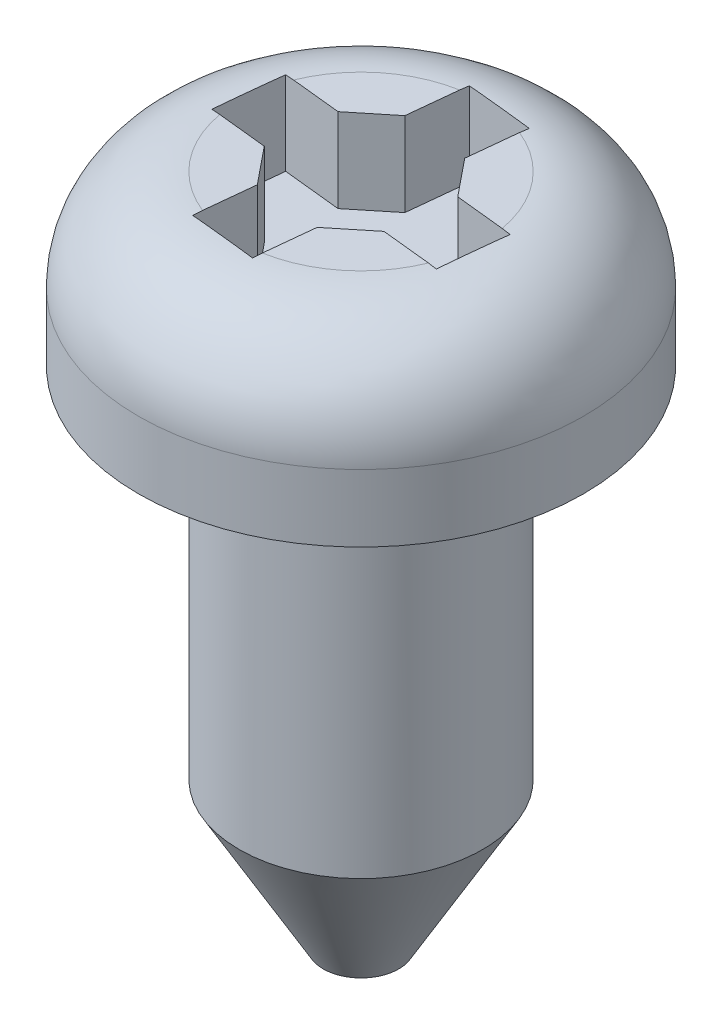
ISO-10303-21;
HEADER;
FILE_DESCRIPTION(('STEP AP214'),'2;1');
FILE_NAME('part.step','',(''),(''),'','','');
FILE_SCHEMA(('AUTOMOTIVE_DESIGN { 1 0 10303 214 1 1 1 1 }'));
ENDSEC;
DATA;
#1=APPLICATION_CONTEXT('core data for automotive mechanical design processes');
#2=APPLICATION_PROTOCOL_DEFINITION('international standard','automotive_design',2000,#1);
#3=PRODUCT_CONTEXT('',#1,'mechanical');
#4=PRODUCT('Part','Part','',(#3));
#5=PRODUCT_RELATED_PRODUCT_CATEGORY('part','',(#4));
#6=PRODUCT_DEFINITION_FORMATION('','',#4);
#7=PRODUCT_DEFINITION_CONTEXT('part definition',#1,'design');
#8=PRODUCT_DEFINITION('design','',#6,#7);
#9=PRODUCT_DEFINITION_SHAPE('','',#8);
#10=(LENGTH_UNIT() NAMED_UNIT(*) SI_UNIT(.MILLI.,.METRE.));
#11=(NAMED_UNIT(*) PLANE_ANGLE_UNIT() SI_UNIT($,.RADIAN.));
#12=(NAMED_UNIT(*) SI_UNIT($,.STERADIAN.) SOLID_ANGLE_UNIT());
#13=UNCERTAINTY_MEASURE_WITH_UNIT(LENGTH_MEASURE(1.E-05),#10,'distance_accuracy_value','');
#14=(GEOMETRIC_REPRESENTATION_CONTEXT(3) GLOBAL_UNCERTAINTY_ASSIGNED_CONTEXT((#13)) GLOBAL_UNIT_ASSIGNED_CONTEXT((#10,
#11,#12)) REPRESENTATION_CONTEXT('',''));
#15=CARTESIAN_POINT('',(0.,0.,0.));
#16=DIRECTION('',(0.,0.,1.));
#17=DIRECTION('',(1.,0.,0.));
#18=AXIS2_PLACEMENT_3D('',#15,#16,#17);
#19=CARTESIAN_POINT('',(-137.886519874981,9.29457308248913,4.83712317671311));
#20=DIRECTION('',(0.630075332995943,0.,0.776534013904125));
#21=DIRECTION('',(0.776534013904125,0.,-0.630075332995943));
#22=AXIS2_PLACEMENT_3D('',#19,#20,#21);
#23=PLANE('',#22);
#24=DIRECTION('',(0.,1.,0.));
#25=VECTOR('',#24,1.);
#26=CARTESIAN_POINT('',(-137.447245901338,9.29457308248913,4.48069874421721));
#27=LINE('',#26,#25);
#28=CARTESIAN_POINT('',(-137.447245901338,10.2945730824891,4.48069874421714));
#29=VERTEX_POINT('',#28);
#30=CARTESIAN_POINT('',(-137.447245901338,9.29457308248913,4.48069874421721));
#31=VERTEX_POINT('',#30);
#32=EDGE_CURVE('E557',#29,#31,#27,.F.);
#33=ORIENTED_EDGE('',*,*,#32,.T.);
#34=DIRECTION('',(-0.776534013904144,0.,0.63007533299592));
#35=VECTOR('',#34,1.);
#36=CARTESIAN_POINT('',(-137.447245901338,9.29457308248913,4.48069874421721));
#37=LINE('',#36,#35);
#38=CARTESIAN_POINT('',(-137.886519874981,9.29457308248913,4.83712317671309));
#39=VERTEX_POINT('',#38);
#40=EDGE_CURVE('E555',#31,#39,#37,.T.);
#41=ORIENTED_EDGE('',*,*,#40,.T.);
#42=DIRECTION('',(0.,1.,0.));
#43=VECTOR('',#42,1.);
#44=CARTESIAN_POINT('',(-137.886519874981,9.29457308248913,4.83712317671308));
#45=LINE('',#44,#43);
#46=CARTESIAN_POINT('',(-137.886519874981,10.2945730824891,4.83712317671314));
#47=VERTEX_POINT('',#46);
#48=EDGE_CURVE('E540',#39,#47,#45,.T.);
#49=ORIENTED_EDGE('',*,*,#48,.T.);
#50=DIRECTION('',(-0.776534013904049,0.,0.630075332996037));
#51=VECTOR('',#50,1.);
#52=CARTESIAN_POINT('',(-137.447245901338,10.2945730824891,4.4806987442171));
#53=LINE('',#52,#51);
#54=EDGE_CURVE('E547',#29,#47,#53,.T.);
#55=ORIENTED_EDGE('',*,*,#54,.F.);
#56=EDGE_LOOP('',(#33,#41,#49,#55));
#57=FACE_BOUND('',#56,.T.);
#58=ADVANCED_FACE('F17',(#57),#23,.F.);
#59=CARTESIAN_POINT('',(-138.68221828112,9.29457308248913,4.75427363556607));
#60=DIRECTION('',(-0.776534013904126,0.,0.630075332995942));
#61=DIRECTION('',(0.630075332995942,0.,0.776534013904126));
#62=AXIS2_PLACEMENT_3D('',#59,#60,#61);
#63=PLANE('',#62);
#64=DIRECTION('',(0.,1.,0.));
#65=VECTOR('',#64,1.);
#66=CARTESIAN_POINT('',(-138.682218281119,9.29457308248913,4.75427363556587));
#67=LINE('',#66,#65);
#68=CARTESIAN_POINT('',(-138.68221828112,10.2945730824891,4.75427363556582));
#69=VERTEX_POINT('',#68);
#70=CARTESIAN_POINT('',(-138.68221828112,9.29457308248913,4.75427363556594));
#71=VERTEX_POINT('',#70);
#72=EDGE_CURVE('E140',#69,#71,#67,.F.);
#73=ORIENTED_EDGE('',*,*,#72,.T.);
#74=DIRECTION('',(-0.630075332996113,0.,-0.776534013903987));
#75=VECTOR('',#74,1.);
#76=CARTESIAN_POINT('',(-138.68221828112,9.29457308248913,4.75427363556607));
#77=LINE('',#76,#75);
#78=CARTESIAN_POINT('',(-139.038642713616,9.29457308248913,4.31499966192314));
#79=VERTEX_POINT('',#78);
#80=EDGE_CURVE('E133',#71,#79,#77,.T.);
#81=ORIENTED_EDGE('',*,*,#80,.T.);
#82=DIRECTION('',(0.,1.,0.));
#83=VECTOR('',#82,1.);
#84=CARTESIAN_POINT('',(-139.038642713616,9.29457308248913,4.31499966192314));
#85=LINE('',#84,#83);
#86=CARTESIAN_POINT('',(-139.038642713616,10.2945730824891,4.31499966192312));
#87=VERTEX_POINT('',#86);
#88=EDGE_CURVE('E476',#79,#87,#85,.T.);
#89=ORIENTED_EDGE('',*,*,#88,.T.);
#90=DIRECTION('',(-0.630075332996226,0.,-0.776534013903895));
#91=VECTOR('',#90,1.);
#92=CARTESIAN_POINT('',(-138.68221828112,10.2945730824891,4.7542736355658));
#93=LINE('',#92,#91);
#94=EDGE_CURVE('E642',#69,#87,#93,.T.);
#95=ORIENTED_EDGE('',*,*,#94,.F.);
#96=EDGE_LOOP('',(#73,#81,#89,#95));
#97=FACE_BOUND('',#96,.T.);
#98=ADVANCED_FACE('F239',(#97),#63,.F.);
#99=CARTESIAN_POINT('',(-138.516519198826,9.29457308248913,3.16287682328872));
#100=DIRECTION('',(-0.630075332995943,0.,-0.776534013904125));
#101=DIRECTION('',(-0.776534013904125,0.,0.630075332995943));
#102=AXIS2_PLACEMENT_3D('',#99,#100,#101);
#103=PLANE('',#102);
#104=DIRECTION('',(0.,1.,0.));
#105=VECTOR('',#104,1.);
#106=CARTESIAN_POINT('',(-138.955793172469,9.29457308248913,3.51930125578437));
#107=LINE('',#106,#105);
#108=CARTESIAN_POINT('',(-138.955793172469,10.2945730824891,3.51930125578437));
#109=VERTEX_POINT('',#108);
#110=CARTESIAN_POINT('',(-138.955793172469,9.29457308248913,3.51930125578437));
#111=VERTEX_POINT('',#110);
#112=EDGE_CURVE('E628',#109,#111,#107,.F.);
#113=ORIENTED_EDGE('',*,*,#112,.T.);
#114=DIRECTION('',(0.77653401390436,0.,-0.630075332995654));
#115=VECTOR('',#114,1.);
#116=CARTESIAN_POINT('',(-138.955793172469,9.29457308248913,3.51930125578437));
#117=LINE('',#116,#115);
#118=CARTESIAN_POINT('',(-138.516519198826,9.29457308248913,3.16287682328874));
#119=VERTEX_POINT('',#118);
#120=EDGE_CURVE('E598',#111,#119,#117,.T.);
#121=ORIENTED_EDGE('',*,*,#120,.T.);
#122=DIRECTION('',(0.,1.,0.));
#123=VECTOR('',#122,1.);
#124=CARTESIAN_POINT('',(-138.516519198826,9.29457308248913,3.16287682328875));
#125=LINE('',#124,#123);
#126=CARTESIAN_POINT('',(-138.516519198826,10.2945730824891,3.16287682328863));
#127=VERTEX_POINT('',#126);
#128=EDGE_CURVE('E392',#119,#127,#125,.T.);
#129=ORIENTED_EDGE('',*,*,#128,.T.);
#130=DIRECTION('',(0.776534013904075,0.,-0.630075332996005));
#131=VECTOR('',#130,1.);
#132=CARTESIAN_POINT('',(-138.955793172469,10.2945730824891,3.51930125578437));
#133=LINE('',#132,#131);
#134=EDGE_CURVE('E412',#109,#127,#133,.T.);
#135=ORIENTED_EDGE('',*,*,#134,.F.);
#136=EDGE_LOOP('',(#113,#121,#129,#135));
#137=FACE_BOUND('',#136,.T.);
#138=ADVANCED_FACE('F236',(#137),#103,.F.);
#139=CARTESIAN_POINT('',(-137.720820792687,9.29457308248913,3.24572636443531));
#140=DIRECTION('',(0.776534013904126,0.,-0.630075332995942));
#141=DIRECTION('',(-0.630075332995942,0.,-0.776534013904126));
#142=AXIS2_PLACEMENT_3D('',#139,#140,#141);
#143=PLANE('',#142);
#144=DIRECTION('',(0.,1.,0.));
#145=VECTOR('',#144,1.);
#146=CARTESIAN_POINT('',(-137.720820792687,9.29457308248913,3.24572636443534));
#147=LINE('',#146,#145);
#148=CARTESIAN_POINT('',(-137.720820792687,10.2945730824891,3.24572636443532));
#149=VERTEX_POINT('',#148);
#150=CARTESIAN_POINT('',(-137.720820792687,9.29457308248913,3.24572636443533));
#151=VERTEX_POINT('',#150);
#152=EDGE_CURVE('E601',#149,#151,#147,.F.);
#153=ORIENTED_EDGE('',*,*,#152,.T.);
#154=DIRECTION('',(0.630075332996023,0.,0.77653401390406));
#155=VECTOR('',#154,1.);
#156=CARTESIAN_POINT('',(-137.720820792687,9.29457308248913,3.24572636443531));
#157=LINE('',#156,#155);
#158=CARTESIAN_POINT('',(-137.364396360191,9.29457308248913,3.68500033807831));
#159=VERTEX_POINT('',#158);
#160=EDGE_CURVE('E558',#151,#159,#157,.T.);
#161=ORIENTED_EDGE('',*,*,#160,.T.);
#162=DIRECTION('',(0.,1.,0.));
#163=VECTOR('',#162,1.);
#164=CARTESIAN_POINT('',(-137.364396360191,9.29457308248913,3.68500033807831));
#165=LINE('',#164,#163);
#166=CARTESIAN_POINT('',(-137.364396360191,10.2945730824891,3.68500033807831));
#167=VERTEX_POINT('',#166);
#168=EDGE_CURVE('E593',#159,#167,#165,.T.);
#169=ORIENTED_EDGE('',*,*,#168,.T.);
#170=DIRECTION('',(0.630075332996023,0.,0.77653401390406));
#171=VECTOR('',#170,1.);
#172=CARTESIAN_POINT('',(-137.720820792687,10.2945730824891,3.24572636443531));
#173=LINE('',#172,#171);
#174=EDGE_CURVE('E329',#149,#167,#173,.T.);
#175=ORIENTED_EDGE('',*,*,#174,.F.);
#176=EDGE_LOOP('',(#153,#161,#169,#175));
#177=FACE_BOUND('',#176,.T.);
#178=ADVANCED_FACE('F233',(#177),#143,.F.);
#179=CARTESIAN_POINT('',(-137.845095104408,9.29457308248913,4.43927397364368));
#180=DIRECTION('',(0.,-1.,0.));
#181=DIRECTION('',(0.,0.,-1.));
#182=AXIS2_PLACEMENT_3D('',#179,#180,#181);
#183=PLANE('',#182);
#184=ORIENTED_EDGE('',*,*,#40,.F.);
#185=DIRECTION('',(0.994623007673419,0.,0.103561926433812));
#186=VECTOR('',#185,1.);
#187=CARTESIAN_POINT('',(-137.447245901338,9.29457308248913,4.48069874421721));
#188=LINE('',#187,#186);
#189=CARTESIAN_POINT('',(-136.751009795967,9.29457308248913,4.55319209272088));
#190=VERTEX_POINT('',#189);
#191=EDGE_CURVE('E562',#31,#190,#188,.T.);
#192=ORIENTED_EDGE('',*,*,#191,.T.);
#193=DIRECTION('',(0.10356192643381,0.,-0.994623007673419));
#194=VECTOR('',#193,1.);
#195=CARTESIAN_POINT('',(-136.751009795967,9.29457308248913,4.55319209272053));
#196=LINE('',#195,#194);
#197=CARTESIAN_POINT('',(-136.66816025482,9.29457308248913,3.75749368658209));
#198=VERTEX_POINT('',#197);
#199=EDGE_CURVE('E173',#190,#198,#196,.T.);
#200=ORIENTED_EDGE('',*,*,#199,.T.);
#201=DIRECTION('',(-0.994623007673419,0.,-0.103561926433812));
#202=VECTOR('',#201,1.);
#203=CARTESIAN_POINT('',(-137.364396360191,9.29457308248913,3.68500033807831));
#204=LINE('',#203,#202);
#205=EDGE_CURVE('E216',#198,#159,#204,.T.);
#206=ORIENTED_EDGE('',*,*,#205,.T.);
#207=ORIENTED_EDGE('',*,*,#160,.F.);
#208=DIRECTION('',(0.103561926433815,0.,-0.994623007673419));
#209=VECTOR('',#208,1.);
#210=CARTESIAN_POINT('',(-137.648327444183,9.29457308248913,2.54949025906405));
#211=LINE('',#210,#209);
#212=CARTESIAN_POINT('',(-137.648327444183,9.29457308248913,2.5494902590641));
#213=VERTEX_POINT('',#212);
#214=EDGE_CURVE('E603',#151,#213,#211,.T.);
#215=ORIENTED_EDGE('',*,*,#214,.T.);
#216=DIRECTION('',(-0.994623007673419,0.,-0.103561926433815));
#217=VECTOR('',#216,1.);
#218=CARTESIAN_POINT('',(-138.444025850322,9.29457308248913,2.46664071791713));
#219=LINE('',#218,#217);
#220=CARTESIAN_POINT('',(-138.444025850322,9.29457308248913,2.46664071791713));
#221=VERTEX_POINT('',#220);
#222=EDGE_CURVE('E391',#213,#221,#219,.T.);
#223=ORIENTED_EDGE('',*,*,#222,.T.);
#224=DIRECTION('',(-0.103561926433815,0.,0.994623007673419));
#225=VECTOR('',#224,1.);
#226=CARTESIAN_POINT('',(-138.444025850322,9.29457308248913,2.46664071791713));
#227=LINE('',#226,#225);
#228=EDGE_CURVE('E613',#221,#119,#227,.T.);
#229=ORIENTED_EDGE('',*,*,#228,.T.);
#230=ORIENTED_EDGE('',*,*,#120,.F.);
#231=DIRECTION('',(-0.994623007673419,0.,-0.103561926433812));
#232=VECTOR('',#231,1.);
#233=CARTESIAN_POINT('',(-138.955793172469,9.29457308248913,3.51930125578437));
#234=LINE('',#233,#232);
#235=CARTESIAN_POINT('',(-139.65202927784,9.29457308248913,3.44680790728074));
#236=VERTEX_POINT('',#235);
#237=EDGE_CURVE('E630',#111,#236,#234,.T.);
#238=ORIENTED_EDGE('',*,*,#237,.T.);
#239=DIRECTION('',(-0.10356192643381,0.,0.994623007673419));
#240=VECTOR('',#239,1.);
#241=CARTESIAN_POINT('',(-139.734878818987,9.29457308248913,4.24250631341928));
#242=LINE('',#241,#240);
#243=CARTESIAN_POINT('',(-139.734878818987,9.29457308248913,4.24250631341936));
#244=VERTEX_POINT('',#243);
#245=EDGE_CURVE('E475',#236,#244,#242,.T.);
#246=ORIENTED_EDGE('',*,*,#245,.T.);
#247=DIRECTION('',(0.994623007673419,0.,0.103561926433812));
#248=VECTOR('',#247,1.);
#249=CARTESIAN_POINT('',(-139.038642713616,9.29457308248913,4.31499966192314));
#250=LINE('',#249,#248);
#251=EDGE_CURVE('E640',#244,#79,#250,.T.);
#252=ORIENTED_EDGE('',*,*,#251,.T.);
#253=ORIENTED_EDGE('',*,*,#80,.F.);
#254=DIRECTION('',(-0.103561926433815,0.,0.994623007673419));
#255=VECTOR('',#254,1.);
#256=CARTESIAN_POINT('',(-138.754711629623,9.29457308248913,5.45050974093747));
#257=LINE('',#256,#255);
#258=CARTESIAN_POINT('',(-138.754711629623,9.29457308248913,5.45050974093747));
#259=VERTEX_POINT('',#258);
#260=EDGE_CURVE('E516',#71,#259,#257,.T.);
#261=ORIENTED_EDGE('',*,*,#260,.T.);
#262=DIRECTION('',(0.994623007673419,0.,0.103561926433815));
#263=VECTOR('',#262,1.);
#264=CARTESIAN_POINT('',(-138.754711629623,9.29457308248913,5.45050974093747));
#265=LINE('',#264,#263);
#266=CARTESIAN_POINT('',(-137.959013223485,9.29457308248913,5.53335928208445));
#267=VERTEX_POINT('',#266);
#268=EDGE_CURVE('E520',#259,#267,#265,.T.);
#269=ORIENTED_EDGE('',*,*,#268,.T.);
#270=DIRECTION('',(0.103561926433815,0.,-0.994623007673419));
#271=VECTOR('',#270,1.);
#272=CARTESIAN_POINT('',(-137.959013223485,9.29457308248913,5.53335928208458));
#273=LINE('',#272,#271);
#274=EDGE_CURVE('E543',#267,#39,#273,.T.);
#275=ORIENTED_EDGE('',*,*,#274,.T.);
#276=EDGE_LOOP('',(#184,#192,#200,#206,#207,#215,#223,#229,#230,#238,#246,#252,#253,#261,#269,#275));
#277=FACE_BOUND('',#276,.T.);
#278=ADVANCED_FACE('F228',(#277),#183,.F.);
#279=CARTESIAN_POINT('',(-137.447245901338,9.29457308248913,4.48069874421721));
#280=DIRECTION('',(-0.103561926433812,0.,0.994623007673419));
#281=DIRECTION('',(0.994623007673419,0.,0.103561926433812));
#282=AXIS2_PLACEMENT_3D('',#279,#280,#281);
#283=PLANE('',#282);
#284=DIRECTION('',(0.,1.,0.));
#285=VECTOR('',#284,1.);
#286=CARTESIAN_POINT('',(-136.751009795967,9.29457308248913,4.5531920927209));
#287=LINE('',#286,#285);
#288=CARTESIAN_POINT('',(-136.751009795967,10.290194536761,4.55319209272087));
#289=VERTEX_POINT('',#288);
#290=EDGE_CURVE('E190',#289,#190,#287,.F.);
#291=ORIENTED_EDGE('',*,*,#290,.T.);
#292=ORIENTED_EDGE('',*,*,#191,.F.);
#293=ORIENTED_EDGE('',*,*,#32,.F.);
#294=DIRECTION('',(-0.994623007673397,0.,-0.103561926434022));
#295=VECTOR('',#294,1.);
#296=CARTESIAN_POINT('',(-136.856702428705,10.2945730824891,4.54218718676979));
#297=LINE('',#296,#295);
#298=CARTESIAN_POINT('',(-136.856702428705,10.2945730824891,4.54218718676978));
#299=VERTEX_POINT('',#298);
#300=EDGE_CURVE('E198',#299,#29,#297,.T.);
#301=ORIENTED_EDGE('',*,*,#300,.F.);
#302=CARTESIAN_POINT('',(-136.751009795967,10.290194536761,4.55319209272084));
#303=CARTESIAN_POINT('',(-136.803626702422,10.2945730824891,4.54771352631587));
#304=CARTESIAN_POINT('',(-136.856702428705,10.2945730824891,4.54218718676977));
#305=B_SPLINE_CURVE_WITH_KNOTS('',2,(#302,#303,#304),.UNSPECIFIED.,.F.,.F.,(3,3),(0.,1.),.UNSPECIFIED.);
#306=EDGE_CURVE('E183',#289,#299,#305,.T.);
#307=ORIENTED_EDGE('',*,*,#306,.F.);
#308=EDGE_LOOP('',(#291,#292,#293,#301,#307));
#309=FACE_BOUND('',#308,.T.);
#310=ADVANCED_FACE('F196',(#309),#283,.F.);
#311=CARTESIAN_POINT('',(-138.201519536903,10.2945730824891,4.00000000000073));
#312=DIRECTION('',(0.,1.,0.));
#313=DIRECTION('',(0.,0.,1.));
#314=AXIS2_PLACEMENT_3D('',#311,#312,#313);
#315=PLANE('',#314);
#316=ORIENTED_EDGE('',*,*,#300,.T.);
#317=ORIENTED_EDGE('',*,*,#54,.T.);
#318=DIRECTION('',(0.103561926433815,0.,-0.994623007673419));
#319=VECTOR('',#318,1.);
#320=CARTESIAN_POINT('',(-137.959013223485,10.2945730824891,5.53335928208458));
#321=LINE('',#320,#319);
#322=CARTESIAN_POINT('',(-137.948008317534,10.2945730824891,5.42766664934629));
#323=VERTEX_POINT('',#322);
#324=EDGE_CURVE('E80',#47,#323,#321,.F.);
#325=ORIENTED_EDGE('',*,*,#324,.T.);
#326=CARTESIAN_POINT('',(-138.201519536903,10.2945730824892,4.00000000000073));
#327=DIRECTION('',(0.,-1.,0.));
#328=DIRECTION('',(0.927460074619624,0.,0.373922197771891));
#329=AXIS2_PLACEMENT_3D('',#326,#327,#328);
#330=CIRCLE('',#329,1.44999999999948);
#331=EDGE_CURVE('E199',#299,#323,#330,.T.);
#332=ORIENTED_EDGE('',*,*,#331,.F.);
#333=EDGE_LOOP('',(#316,#317,#325,#332));
#334=FACE_BOUND('',#333,.T.);
#335=ADVANCED_FACE('F227',(#334),#315,.T.);
#336=CARTESIAN_POINT('',(-137.959013223485,9.29457308248913,5.53335928208458));
#337=DIRECTION('',(0.994623007673419,0.,0.103561926433815));
#338=DIRECTION('',(0.103561926433815,0.,-0.994623007673419));
#339=AXIS2_PLACEMENT_3D('',#336,#337,#338);
#340=PLANE('',#339);
#341=ORIENTED_EDGE('',*,*,#324,.F.);
#342=ORIENTED_EDGE('',*,*,#48,.F.);
#343=ORIENTED_EDGE('',*,*,#274,.F.);
#344=DIRECTION('',(0.,1.,0.));
#345=VECTOR('',#344,1.);
#346=CARTESIAN_POINT('',(-137.959013223485,9.29457308248913,5.53335928208445));
#347=LINE('',#346,#345);
#348=CARTESIAN_POINT('',(-137.959013223485,10.2901945367611,5.53335928208445));
#349=VERTEX_POINT('',#348);
#350=EDGE_CURVE('E71',#267,#349,#347,.T.);
#351=ORIENTED_EDGE('',*,*,#350,.T.);
#352=CARTESIAN_POINT('',(-137.948008317534,10.2945730824891,5.42766664934638));
#353=CARTESIAN_POINT('',(-137.95353465708,10.2945730824891,5.48074237562602));
#354=CARTESIAN_POINT('',(-137.959013223485,10.2901945367611,5.53335928208458));
#355=B_SPLINE_CURVE_WITH_KNOTS('',2,(#352,#353,#354),.UNSPECIFIED.,.F.,.F.,(3,3),(0.,1.),.UNSPECIFIED.);
#356=EDGE_CURVE('E201',#323,#349,#355,.T.);
#357=ORIENTED_EDGE('',*,*,#356,.F.);
#358=EDGE_LOOP('',(#341,#342,#343,#351,#357));
#359=FACE_BOUND('',#358,.T.);
#360=ADVANCED_FACE('F526',(#359),#340,.F.);
#361=CARTESIAN_POINT('',(-138.754711629623,9.29457308248913,5.45050974093747));
#362=DIRECTION('',(-0.103561926433815,0.,0.994623007673419));
#363=DIRECTION('',(0.994623007673419,0.,0.103561926433815));
#364=AXIS2_PLACEMENT_3D('',#361,#362,#363);
#365=PLANE('',#364);
#366=ORIENTED_EDGE('',*,*,#350,.F.);
#367=ORIENTED_EDGE('',*,*,#268,.F.);
#368=DIRECTION('',(0.,1.,0.));
#369=VECTOR('',#368,1.);
#370=CARTESIAN_POINT('',(-138.754711629623,9.29457308248913,5.45050974093747));
#371=LINE('',#370,#369);
#372=CARTESIAN_POINT('',(-138.754711629623,10.290194536761,5.45050974093753));
#373=VERTEX_POINT('',#372);
#374=EDGE_CURVE('E509',#259,#373,#371,.T.);
#375=ORIENTED_EDGE('',*,*,#374,.T.);
#376=CARTESIAN_POINT('',(-137.959013223485,10.2901945367611,5.53335928208445));
#377=CARTESIAN_POINT('',(-137.99216328829,10.2909269774353,5.52990763804839));
#378=CARTESIAN_POINT('',(-138.02531627542,10.2914873019811,5.52645568973455));
#379=CARTESIAN_POINT('',(-138.091624732795,10.2923586930538,5.51955153456054));
#380=CARTESIAN_POINT('',(-138.124780202951,10.2926697661586,5.5160993277096));
#381=CARTESIAN_POINT('',(-138.224243719473,10.2933715731058,5.50574300847962));
#382=CARTESIAN_POINT('',(-138.290553073014,10.2935309633173,5.49883875999529));
#383=CARTESIAN_POINT('',(-138.423171780094,10.2935309633173,5.48503026302663));
#384=CARTESIAN_POINT('',(-138.489481133634,10.2933715731058,5.4781260145423));
#385=CARTESIAN_POINT('',(-138.588944650157,10.2926697661586,5.46776969531232));
#386=CARTESIAN_POINT('',(-138.622100120313,10.2923586930538,5.46431748846138));
#387=CARTESIAN_POINT('',(-138.688408577688,10.2914873019811,5.45741333328736));
#388=CARTESIAN_POINT('',(-138.721561564818,10.2909269774353,5.45396138497351));
#389=CARTESIAN_POINT('',(-138.754711629623,10.2901945367611,5.45050974093742));
#390=B_SPLINE_CURVE_WITH_KNOTS('',3,(#376,#377,#378,#379,#380,#381,#382,#383,#384,#385,#386,
#387,#388,#389),.UNSPECIFIED.,.F.,.F.,(4,2,2,2,2,2,4),(0.,0.10001033013555,0.200018020854164,
0.400020729845984,0.600023438837803,0.700031129556418,0.800041459691973),.UNSPECIFIED.);
#391=EDGE_CURVE('E675',#349,#373,#390,.T.);
#392=ORIENTED_EDGE('',*,*,#391,.F.);
#393=EDGE_LOOP('',(#366,#367,#375,#392));
#394=FACE_BOUND('',#393,.T.);
#395=ADVANCED_FACE('F503',(#394),#365,.F.);
#396=CARTESIAN_POINT('',(-138.754711629623,9.29457308248913,5.45050974093747));
#397=DIRECTION('',(-0.994623007673419,0.,-0.103561926433815));
#398=DIRECTION('',(-0.103561926433815,0.,0.994623007673419));
#399=AXIS2_PLACEMENT_3D('',#396,#397,#398);
#400=PLANE('',#399);
#401=ORIENTED_EDGE('',*,*,#374,.F.);
#402=ORIENTED_EDGE('',*,*,#260,.F.);
#403=ORIENTED_EDGE('',*,*,#72,.F.);
#404=DIRECTION('',(0.103561926432852,0.,-0.994623007673519));
#405=VECTOR('',#404,1.);
#406=CARTESIAN_POINT('',(-138.743706723672,10.2945730824891,5.34481710819911));
#407=LINE('',#406,#405);
#408=CARTESIAN_POINT('',(-138.743706723672,10.2945730824891,5.34481710819911));
#409=VERTEX_POINT('',#408);
#410=EDGE_CURVE('E488',#409,#69,#407,.T.);
#411=ORIENTED_EDGE('',*,*,#410,.F.);
#412=CARTESIAN_POINT('',(-138.754711629623,10.290194536761,5.45050974093753));
#413=CARTESIAN_POINT('',(-138.749233063218,10.2945730824891,5.39789283447886));
#414=CARTESIAN_POINT('',(-138.743706723672,10.2945730824891,5.34481710819912));
#415=B_SPLINE_CURVE_WITH_KNOTS('',2,(#412,#413,#414),.UNSPECIFIED.,.F.,.F.,(3,3),(0.,1.),.UNSPECIFIED.);
#416=EDGE_CURVE('E460',#373,#409,#415,.T.);
#417=ORIENTED_EDGE('',*,*,#416,.F.);
#418=EDGE_LOOP('',(#401,#402,#403,#411,#417));
#419=FACE_BOUND('',#418,.T.);
#420=ADVANCED_FACE('F499',(#419),#400,.F.);
#421=CARTESIAN_POINT('',(-138.201519536903,10.2945730824891,4.00000000000073));
#422=DIRECTION('',(0.,1.,0.));
#423=DIRECTION('',(0.,0.,1.));
#424=AXIS2_PLACEMENT_3D('',#421,#422,#423);
#425=PLANE('',#424);
#426=DIRECTION('',(0.994623007673419,0.,0.103561926433812));
#427=VECTOR('',#426,1.);
#428=CARTESIAN_POINT('',(-139.038642713616,10.2945730824891,4.31499966192314));
#429=LINE('',#428,#427);
#430=CARTESIAN_POINT('',(-139.629186186249,10.2945730824891,4.25351121937046));
#431=VERTEX_POINT('',#430);
#432=EDGE_CURVE('E468',#87,#431,#429,.F.);
#433=ORIENTED_EDGE('',*,*,#432,.T.);
#434=CARTESIAN_POINT('',(-138.201519536903,10.2945730824892,4.00000000000073));
#435=DIRECTION('',(0.,-1.,0.));
#436=DIRECTION('',(-0.373922197771777,0.,0.92746007461967));
#437=AXIS2_PLACEMENT_3D('',#434,#435,#436);
#438=CIRCLE('',#437,1.44999999999984);
#439=EDGE_CURVE('E459',#409,#431,#438,.T.);
#440=ORIENTED_EDGE('',*,*,#439,.F.);
#441=ORIENTED_EDGE('',*,*,#410,.T.);
#442=ORIENTED_EDGE('',*,*,#94,.T.);
#443=EDGE_LOOP('',(#433,#440,#441,#442));
#444=FACE_BOUND('',#443,.T.);
#445=ADVANCED_FACE('F490',(#444),#425,.T.);
#446=CARTESIAN_POINT('',(-139.038642713616,9.29457308248913,4.31499966192314));
#447=DIRECTION('',(-0.103561926433812,0.,0.994623007673419));
#448=DIRECTION('',(0.994623007673419,0.,0.103561926433812));
#449=AXIS2_PLACEMENT_3D('',#446,#447,#448);
#450=PLANE('',#449);
#451=ORIENTED_EDGE('',*,*,#432,.F.);
#452=ORIENTED_EDGE('',*,*,#88,.F.);
#453=ORIENTED_EDGE('',*,*,#251,.F.);
#454=DIRECTION('',(0.,1.,0.));
#455=VECTOR('',#454,1.);
#456=CARTESIAN_POINT('',(-139.734878818987,9.29457308248913,4.24250631341928));
#457=LINE('',#456,#455);
#458=CARTESIAN_POINT('',(-139.734878818987,10.2901945367611,4.2425063134193));
#459=VERTEX_POINT('',#458);
#460=EDGE_CURVE('E631',#244,#459,#457,.T.);
#461=ORIENTED_EDGE('',*,*,#460,.T.);
#462=CARTESIAN_POINT('',(-139.629186186249,10.2945730824891,4.25351121937057));
#463=CARTESIAN_POINT('',(-139.682261912527,10.2945730824891,4.24798487982501));
#464=CARTESIAN_POINT('',(-139.734878818987,10.2901945367611,4.24250631341951));
#465=B_SPLINE_CURVE_WITH_KNOTS('',2,(#462,#463,#464),.UNSPECIFIED.,.F.,.F.,(3,3),(0.,1.),.UNSPECIFIED.);
#466=EDGE_CURVE('E455',#431,#459,#465,.T.);
#467=ORIENTED_EDGE('',*,*,#466,.F.);
#468=EDGE_LOOP('',(#451,#452,#453,#461,#467));
#469=FACE_BOUND('',#468,.T.);
#470=ADVANCED_FACE('F443',(#469),#450,.F.);
#471=CARTESIAN_POINT('',(-139.734878818987,9.29457308248913,4.24250631341928));
#472=DIRECTION('',(-0.994623007673419,0.,-0.10356192643381));
#473=DIRECTION('',(-0.10356192643381,0.,0.994623007673419));
#474=AXIS2_PLACEMENT_3D('',#471,#472,#473);
#475=PLANE('',#474);
#476=CARTESIAN_POINT('',(-139.734878818987,10.2901945367611,4.24250631341932));
#477=CARTESIAN_POINT('',(-139.731427174951,10.2909269774352,4.20935624861472));
#478=CARTESIAN_POINT('',(-139.727975226637,10.2914873019811,4.17620326148448));
#479=CARTESIAN_POINT('',(-139.721071071463,10.2923586930538,4.10989480410938));
#480=CARTESIAN_POINT('',(-139.717618864612,10.2926697661586,4.07673933395314));
#481=CARTESIAN_POINT('',(-139.707262545382,10.2933715731058,3.97727581743056));
#482=CARTESIAN_POINT('',(-139.700358296898,10.2935309633173,3.91096646389027));
#483=CARTESIAN_POINT('',(-139.686549799929,10.2935309633173,3.77834775680969));
#484=CARTESIAN_POINT('',(-139.679645551445,10.2933715731058,3.71203840326941));
#485=CARTESIAN_POINT('',(-139.669289232215,10.2926697661586,3.61257488674685));
#486=CARTESIAN_POINT('',(-139.665837025364,10.2923586930538,3.57941941659061));
#487=CARTESIAN_POINT('',(-139.65893287019,10.2914873019811,3.51311095921551));
#488=CARTESIAN_POINT('',(-139.655480921876,10.2909269774352,3.47995797208528));
#489=CARTESIAN_POINT('',(-139.65202927784,10.2901945367611,3.44680790728068));
#490=B_SPLINE_CURVE_WITH_KNOTS('',3,(#476,#477,#478,#479,#480,#481,#482,#483,#484,#485,#486,
#487,#488,#489),.UNSPECIFIED.,.F.,.F.,(4,2,2,2,2,2,4),(0.,0.100010330135618,0.200018020854344,
0.400020729846319,0.600023438838275,0.700031129556987,0.800041459692595),.UNSPECIFIED.);
#491=CARTESIAN_POINT('',(-139.65202927784,10.290194536761,3.44680790728074));
#492=VERTEX_POINT('',#491);
#493=EDGE_CURVE('E448',#459,#492,#490,.T.);
#494=ORIENTED_EDGE('',*,*,#493,.F.);
#495=ORIENTED_EDGE('',*,*,#460,.F.);
#496=ORIENTED_EDGE('',*,*,#245,.F.);
#497=DIRECTION('',(0.,1.,0.));
#498=VECTOR('',#497,1.);
#499=CARTESIAN_POINT('',(-139.65202927784,9.29457308248913,3.44680790728074));
#500=LINE('',#499,#498);
#501=EDGE_CURVE('E413',#236,#492,#500,.T.);
#502=ORIENTED_EDGE('',*,*,#501,.T.);
#503=EDGE_LOOP('',(#494,#495,#496,#502));
#504=FACE_BOUND('',#503,.T.);
#505=ADVANCED_FACE('F438',(#504),#475,.F.);
#506=CARTESIAN_POINT('',(-138.955793172469,9.29457308248913,3.51930125578437));
#507=DIRECTION('',(0.103561926433812,0.,-0.994623007673419));
#508=DIRECTION('',(-0.994623007673419,0.,-0.103561926433812));
#509=AXIS2_PLACEMENT_3D('',#506,#507,#508);
#510=PLANE('',#509);
#511=ORIENTED_EDGE('',*,*,#501,.F.);
#512=ORIENTED_EDGE('',*,*,#237,.F.);
#513=ORIENTED_EDGE('',*,*,#112,.F.);
#514=DIRECTION('',(0.994623007673418,0.,0.103561926433818));
#515=VECTOR('',#514,1.);
#516=CARTESIAN_POINT('',(-139.546336645102,10.2945730824891,3.4578128132318));
#517=LINE('',#516,#515);
#518=CARTESIAN_POINT('',(-139.546336645102,10.2945730824891,3.4578128132318));
#519=VERTEX_POINT('',#518);
#520=EDGE_CURVE('E405',#519,#109,#517,.T.);
#521=ORIENTED_EDGE('',*,*,#520,.F.);
#522=CARTESIAN_POINT('',(-139.65202927784,10.290194536761,3.44680790728074));
#523=CARTESIAN_POINT('',(-139.599412371385,10.2945730824891,3.45228647368571));
#524=CARTESIAN_POINT('',(-139.546336645102,10.2945730824891,3.4578128132318));
#525=B_SPLINE_CURVE_WITH_KNOTS('',2,(#522,#523,#524),.UNSPECIFIED.,.F.,.F.,(3,3),(0.,1.),.UNSPECIFIED.);
#526=EDGE_CURVE('E454',#492,#519,#525,.T.);
#527=ORIENTED_EDGE('',*,*,#526,.F.);
#528=EDGE_LOOP('',(#511,#512,#513,#521,#527));
#529=FACE_BOUND('',#528,.T.);
#530=ADVANCED_FACE('F429',(#529),#510,.F.);
#531=CARTESIAN_POINT('',(-138.201519536903,10.2945730824891,4.00000000000073));
#532=DIRECTION('',(0.,1.,0.));
#533=DIRECTION('',(0.,0.,1.));
#534=AXIS2_PLACEMENT_3D('',#531,#532,#533);
#535=PLANE('',#534);
#536=DIRECTION('',(-0.103561926433815,0.,0.994623007673419));
#537=VECTOR('',#536,1.);
#538=CARTESIAN_POINT('',(-138.444025850322,10.2945730824891,2.46664071791713));
#539=LINE('',#538,#537);
#540=CARTESIAN_POINT('',(-138.455030756273,10.2945730824891,2.57233335065522));
#541=VERTEX_POINT('',#540);
#542=EDGE_CURVE('E384',#127,#541,#539,.F.);
#543=ORIENTED_EDGE('',*,*,#542,.T.);
#544=CARTESIAN_POINT('',(-138.201519536903,10.2945730824892,4.00000000000073));
#545=DIRECTION('',(0.,-1.,0.));
#546=DIRECTION('',(-0.92746007461975,0.,-0.373922197771579));
#547=AXIS2_PLACEMENT_3D('',#544,#545,#546);
#548=CIRCLE('',#547,1.45000000000039);
#549=EDGE_CURVE('E400',#519,#541,#548,.T.);
#550=ORIENTED_EDGE('',*,*,#549,.F.);
#551=ORIENTED_EDGE('',*,*,#520,.T.);
#552=ORIENTED_EDGE('',*,*,#134,.T.);
#553=EDGE_LOOP('',(#543,#550,#551,#552));
#554=FACE_BOUND('',#553,.T.);
#555=ADVANCED_FACE('F374',(#554),#535,.T.);
#556=CARTESIAN_POINT('',(-138.444025850322,9.29457308248913,2.46664071791713));
#557=DIRECTION('',(-0.994623007673419,0.,-0.103561926433815));
#558=DIRECTION('',(-0.103561926433815,0.,0.994623007673419));
#559=AXIS2_PLACEMENT_3D('',#556,#557,#558);
#560=PLANE('',#559);
#561=ORIENTED_EDGE('',*,*,#542,.F.);
#562=ORIENTED_EDGE('',*,*,#128,.F.);
#563=ORIENTED_EDGE('',*,*,#228,.F.);
#564=DIRECTION('',(0.,1.,0.));
#565=VECTOR('',#564,1.);
#566=CARTESIAN_POINT('',(-138.444025850322,9.29457308248913,2.46664071791713));
#567=LINE('',#566,#565);
#568=CARTESIAN_POINT('',(-138.444025850322,10.2901945367611,2.46664071791712));
#569=VERTEX_POINT('',#568);
#570=EDGE_CURVE('E604',#221,#569,#567,.T.);
#571=ORIENTED_EDGE('',*,*,#570,.T.);
#572=CARTESIAN_POINT('',(-138.455030756273,10.2945730824891,2.57233335065532));
#573=CARTESIAN_POINT('',(-138.449504416727,10.2945730824891,2.51925762437566));
#574=CARTESIAN_POINT('',(-138.444025850322,10.2901945367611,2.46664071791707));
#575=B_SPLINE_CURVE_WITH_KNOTS('',2,(#572,#573,#574),.UNSPECIFIED.,.F.,.F.,(3,3),(0.,1.),.UNSPECIFIED.);
#576=EDGE_CURVE('E362',#541,#569,#575,.T.);
#577=ORIENTED_EDGE('',*,*,#576,.F.);
#578=EDGE_LOOP('',(#561,#562,#563,#571,#577));
#579=FACE_BOUND('',#578,.T.);
#580=ADVANCED_FACE('F369',(#579),#560,.F.);
#581=CARTESIAN_POINT('',(-138.444025850322,9.29457308248913,2.46664071791713));
#582=DIRECTION('',(0.103561926433815,0.,-0.994623007673419));
#583=DIRECTION('',(-0.994623007673419,0.,-0.103561926433815));
#584=AXIS2_PLACEMENT_3D('',#581,#582,#583);
#585=PLANE('',#584);
#586=ORIENTED_EDGE('',*,*,#570,.F.);
#587=ORIENTED_EDGE('',*,*,#222,.F.);
#588=DIRECTION('',(0.,1.,0.));
#589=VECTOR('',#588,1.);
#590=CARTESIAN_POINT('',(-137.648327444183,9.29457308248913,2.54949025906405));
#591=LINE('',#590,#589);
#592=CARTESIAN_POINT('',(-137.648327444183,10.290194536761,2.54949025906405));
#593=VERTEX_POINT('',#592);
#594=EDGE_CURVE('E330',#213,#593,#591,.T.);
#595=ORIENTED_EDGE('',*,*,#594,.T.);
#596=CARTESIAN_POINT('',(-138.444025850322,10.2901945367611,2.46664071791711));
#597=CARTESIAN_POINT('',(-138.410875785517,10.2909269774353,2.47009236195319));
#598=CARTESIAN_POINT('',(-138.377722798387,10.2914873019811,2.47354431026703));
#599=CARTESIAN_POINT('',(-138.311414341012,10.2923586930538,2.48044846544105));
#600=CARTESIAN_POINT('',(-138.278258870856,10.2926697661586,2.483900672292));
#601=CARTESIAN_POINT('',(-138.178795354333,10.2933715731058,2.49425699152199));
#602=CARTESIAN_POINT('',(-138.112486000793,10.2935309633173,2.50116124000633));
#603=CARTESIAN_POINT('',(-137.979867293712,10.2935309633173,2.514969736975));
#604=CARTESIAN_POINT('',(-137.913557940172,10.2933715731058,2.52187398545934));
#605=CARTESIAN_POINT('',(-137.814094423649,10.2926697661586,2.53223030468933));
#606=CARTESIAN_POINT('',(-137.780938953493,10.2923586930539,2.53568251154028));
#607=CARTESIAN_POINT('',(-137.714630496118,10.2914873019811,2.5425866667143));
#608=CARTESIAN_POINT('',(-137.681477508988,10.2909269774353,2.54603861502815));
#609=CARTESIAN_POINT('',(-137.648327444183,10.2901945367611,2.54949025906424));
#610=B_SPLINE_CURVE_WITH_KNOTS('',3,(#596,#597,#598,#599,#600,#601,#602,#603,#604,#605,#606,
#607,#608,#609),.UNSPECIFIED.,.F.,.F.,(4,2,2,2,2,2,4),(0.,0.100010330135663,0.20001802085439,
0.400020729846432,0.600023438838475,0.700031129557229,0.800041459692866),.UNSPECIFIED.);
#611=EDGE_CURVE('E356',#569,#593,#610,.T.);
#612=ORIENTED_EDGE('',*,*,#611,.F.);
#613=EDGE_LOOP('',(#586,#587,#595,#612));
#614=FACE_BOUND('',#613,.T.);
#615=ADVANCED_FACE('F365',(#614),#585,.F.);
#616=CARTESIAN_POINT('',(-137.648327444183,9.29457308248913,2.54949025906405));
#617=DIRECTION('',(0.994623007673419,0.,0.103561926433815));
#618=DIRECTION('',(0.103561926433815,0.,-0.994623007673419));
#619=AXIS2_PLACEMENT_3D('',#616,#617,#618);
#620=PLANE('',#619);
#621=ORIENTED_EDGE('',*,*,#594,.F.);
#622=ORIENTED_EDGE('',*,*,#214,.F.);
#623=ORIENTED_EDGE('',*,*,#152,.F.);
#624=DIRECTION('',(-0.103561926434472,0.,0.99462300767335));
#625=VECTOR('',#624,1.);
#626=CARTESIAN_POINT('',(-137.659332350134,10.2945730824891,2.65518289180201));
#627=LINE('',#626,#625);
#628=CARTESIAN_POINT('',(-137.659332350134,10.2945730824891,2.65518289180201));
#629=VERTEX_POINT('',#628);
#630=EDGE_CURVE('E321',#629,#149,#627,.T.);
#631=ORIENTED_EDGE('',*,*,#630,.F.);
#632=CARTESIAN_POINT('',(-137.648327444183,10.290194536761,2.54949025906405));
#633=CARTESIAN_POINT('',(-137.653806010588,10.2945730824891,2.60210716552246));
#634=CARTESIAN_POINT('',(-137.659332350134,10.2945730824891,2.655182891802));
#635=B_SPLINE_CURVE_WITH_KNOTS('',2,(#632,#633,#634),.UNSPECIFIED.,.F.,.F.,(3,3),(0.,1.),.UNSPECIFIED.);
#636=EDGE_CURVE('E354',#593,#629,#635,.T.);
#637=ORIENTED_EDGE('',*,*,#636,.F.);
#638=EDGE_LOOP('',(#621,#622,#623,#631,#637));
#639=FACE_BOUND('',#638,.T.);
#640=ADVANCED_FACE('F311',(#639),#620,.F.);
#641=CARTESIAN_POINT('',(-138.201519536903,10.2945730824891,4.00000000000073));
#642=DIRECTION('',(0.,1.,0.));
#643=DIRECTION('',(0.,0.,1.));
#644=AXIS2_PLACEMENT_3D('',#641,#642,#643);
#645=PLANE('',#644);
#646=DIRECTION('',(-0.994623007673419,0.,-0.103561926433812));
#647=VECTOR('',#646,1.);
#648=CARTESIAN_POINT('',(-137.364396360191,10.2945730824891,3.68500033807831));
#649=LINE('',#648,#647);
#650=CARTESIAN_POINT('',(-136.773852887558,10.2945730824891,3.74648878063094));
#651=VERTEX_POINT('',#650);
#652=EDGE_CURVE('E194',#167,#651,#649,.F.);
#653=ORIENTED_EDGE('',*,*,#652,.T.);
#654=CARTESIAN_POINT('',(-138.201519536903,10.2945730824892,4.00000000000073));
#655=DIRECTION('',(0.,-1.,0.));
#656=DIRECTION('',(0.373922197771678,0.,-0.92746007461971));
#657=AXIS2_PLACEMENT_3D('',#654,#655,#656);
#658=CIRCLE('',#657,1.45000000000015);
#659=EDGE_CURVE('E335',#629,#651,#658,.T.);
#660=ORIENTED_EDGE('',*,*,#659,.F.);
#661=ORIENTED_EDGE('',*,*,#630,.T.);
#662=ORIENTED_EDGE('',*,*,#174,.T.);
#663=EDGE_LOOP('',(#653,#660,#661,#662));
#664=FACE_BOUND('',#663,.T.);
#665=ADVANCED_FACE('F306',(#664),#645,.T.);
#666=CARTESIAN_POINT('',(-137.364396360191,9.29457308248913,3.68500033807831));
#667=DIRECTION('',(0.103561926433812,0.,-0.994623007673419));
#668=DIRECTION('',(-0.994623007673419,0.,-0.103561926433812));
#669=AXIS2_PLACEMENT_3D('',#666,#667,#668);
#670=PLANE('',#669);
#671=ORIENTED_EDGE('',*,*,#652,.F.);
#672=ORIENTED_EDGE('',*,*,#168,.F.);
#673=ORIENTED_EDGE('',*,*,#205,.F.);
#674=DIRECTION('',(0.,1.,0.));
#675=VECTOR('',#674,1.);
#676=CARTESIAN_POINT('',(-136.66816025482,9.29457308248913,3.75749368658217));
#677=LINE('',#676,#675);
#678=CARTESIAN_POINT('',(-136.66816025482,10.2901945367611,3.7574936865822));
#679=VERTEX_POINT('',#678);
#680=EDGE_CURVE('E37',#198,#679,#677,.T.);
#681=ORIENTED_EDGE('',*,*,#680,.T.);
#682=CARTESIAN_POINT('',(-136.773852887558,10.2945730824891,3.74648878063088));
#683=CARTESIAN_POINT('',(-136.720777161277,10.2945730824891,3.75201512017674));
#684=CARTESIAN_POINT('',(-136.66816025482,10.2901945367611,3.75749368658194));
#685=B_SPLINE_CURVE_WITH_KNOTS('',2,(#682,#683,#684),.UNSPECIFIED.,.F.,.F.,(3,3),(0.,1.),.UNSPECIFIED.);
#686=EDGE_CURVE('E185',#651,#679,#685,.T.);
#687=ORIENTED_EDGE('',*,*,#686,.F.);
#688=EDGE_LOOP('',(#671,#672,#673,#681,#687));
#689=FACE_BOUND('',#688,.T.);
#690=ADVANCED_FACE('F297',(#689),#670,.F.);
#691=CARTESIAN_POINT('',(-136.751009795967,9.29457308248913,4.55319209272053));
#692=DIRECTION('',(0.994623007673419,0.,0.10356192643381));
#693=DIRECTION('',(0.10356192643381,0.,-0.994623007673419));
#694=AXIS2_PLACEMENT_3D('',#691,#692,#693);
#695=PLANE('',#694);
#696=CARTESIAN_POINT('',(-136.66816025482,10.2901945367612,3.75749368658217));
#697=CARTESIAN_POINT('',(-136.671611898856,10.2909269774353,3.79064375138676));
#698=CARTESIAN_POINT('',(-136.67506384717,10.2914873019812,3.82379673851699));
#699=CARTESIAN_POINT('',(-136.681968002344,10.2923586930539,3.89010519589207));
#700=CARTESIAN_POINT('',(-136.685420209195,10.2926697661586,3.9232606660483));
#701=CARTESIAN_POINT('',(-136.695776528425,10.2933715731059,4.02272418257086));
#702=CARTESIAN_POINT('',(-136.702680776909,10.2935309633174,4.08903353611113));
#703=CARTESIAN_POINT('',(-136.716489273878,10.2935309633174,4.22165224319172));
#704=CARTESIAN_POINT('',(-136.723393522362,10.2933715731059,4.28796159673203));
#705=CARTESIAN_POINT('',(-136.733749841592,10.2926697661586,4.38742511325464));
#706=CARTESIAN_POINT('',(-136.737202048443,10.2923586930539,4.4205805834109));
#707=CARTESIAN_POINT('',(-136.744106203617,10.2914873019812,4.48688904078603));
#708=CARTESIAN_POINT('',(-136.747558151931,10.2909269774353,4.52004202791628));
#709=CARTESIAN_POINT('',(-136.751009795967,10.2901945367612,4.55319209272089));
#710=B_SPLINE_CURVE_WITH_KNOTS('',3,(#696,#697,#698,#699,#700,#701,#702,#703,#704,#705,#706,
#707,#708,#709),.UNSPECIFIED.,.F.,.F.,(4,2,2,2,2,2,4),(0.,0.100010330135588,0.200018020854285,
0.400020729846208,0.600023438838257,0.700031129557015,0.800041459692673),.UNSPECIFIED.);
#711=EDGE_CURVE('E178',#679,#289,#710,.T.);
#712=ORIENTED_EDGE('',*,*,#711,.F.);
#713=ORIENTED_EDGE('',*,*,#680,.F.);
#714=ORIENTED_EDGE('',*,*,#199,.F.);
#715=ORIENTED_EDGE('',*,*,#290,.F.);
#716=EDGE_LOOP('',(#712,#713,#714,#715));
#717=FACE_BOUND('',#716,.T.);
#718=ADVANCED_FACE('F191',(#717),#695,.F.);
#719=CARTESIAN_POINT('',(-138.201519536903,9.09457308248915,4.00000000000073));
#720=DIRECTION('',(0.,1.,0.));
#721=DIRECTION('',(-0.994623007673419,0.,-0.103561926433808));
#722=AXIS2_PLACEMENT_3D('',#719,#720,#721);
#723=TOROIDAL_SURFACE('',#722,1.45000000000001,1.2);
#724=CARTESIAN_POINT('',(-138.201519536903,9.09457308248915,4.00000000000073));
#725=DIRECTION('',(0.,1.,0.));
#726=DIRECTION('',(0.,0.,1.));
#727=AXIS2_PLACEMENT_3D('',#724,#725,#726);
#728=CIRCLE('',#727,2.65000000000002);
#729=CARTESIAN_POINT('',(-138.201519536903,9.09457308248915,6.65000000000075));
#730=VERTEX_POINT('',#729);
#731=EDGE_CURVE('E187',#730,#730,#728,.F.);
#732=ORIENTED_EDGE('',*,*,#731,.F.);
#733=EDGE_LOOP('',(#732));
#734=FACE_BOUND('',#733,.T.);
#735=ORIENTED_EDGE('',*,*,#686,.T.);
#736=ORIENTED_EDGE('',*,*,#711,.T.);
#737=ORIENTED_EDGE('',*,*,#306,.T.);
#738=ORIENTED_EDGE('',*,*,#331,.T.);
#739=ORIENTED_EDGE('',*,*,#356,.T.);
#740=ORIENTED_EDGE('',*,*,#391,.T.);
#741=ORIENTED_EDGE('',*,*,#416,.T.);
#742=ORIENTED_EDGE('',*,*,#439,.T.);
#743=ORIENTED_EDGE('',*,*,#466,.T.);
#744=ORIENTED_EDGE('',*,*,#493,.T.);
#745=ORIENTED_EDGE('',*,*,#526,.T.);
#746=ORIENTED_EDGE('',*,*,#549,.T.);
#747=ORIENTED_EDGE('',*,*,#576,.T.);
#748=ORIENTED_EDGE('',*,*,#611,.T.);
#749=ORIENTED_EDGE('',*,*,#636,.T.);
#750=ORIENTED_EDGE('',*,*,#659,.T.);
#751=EDGE_LOOP('',(#735,#736,#737,#738,#739,#740,#741,#742,#743,#744,#745,#746,#747,#748,#749,#750));
#752=FACE_BOUND('',#751,.T.);
#753=ADVANCED_FACE('F180',(#734,#752),#723,.T.);
#754=CARTESIAN_POINT('',(-138.201519536903,2.29457308248912,4.00000000000053));
#755=DIRECTION('',(0.,1.,0.));
#756=DIRECTION('',(0.,0.,1.));
#757=AXIS2_PLACEMENT_3D('',#754,#755,#756);
#758=PLANE('',#757);
#759=CARTESIAN_POINT('',(-138.201519536903,2.29457308250858,4.00000000000063));
#760=DIRECTION('',(0.,1.,0.));
#761=DIRECTION('',(0.,0.,1.));
#762=AXIS2_PLACEMENT_3D('',#759,#760,#761);
#763=CIRCLE('',#762,0.450000000002124);
#764=CARTESIAN_POINT('',(-138.201519536903,2.29457308250858,4.45000000000275));
#765=VERTEX_POINT('',#764);
#766=EDGE_CURVE('E568',#765,#765,#763,.T.);
#767=ORIENTED_EDGE('',*,*,#766,.F.);
#768=EDGE_LOOP('',(#767));
#769=FACE_BOUND('',#768,.T.);
#770=ADVANCED_FACE('F267',(#769),#758,.F.);
#771=CARTESIAN_POINT('',(-138.201519536903,10.2945730824891,4.00000000000073));
#772=DIRECTION('',(0.,1.,0.));
#773=DIRECTION('',(0.,0.,1.));
#774=AXIS2_PLACEMENT_3D('',#771,#772,#773);
#775=CYLINDRICAL_SURFACE('',#774,2.65000000000002);
#776=ORIENTED_EDGE('',*,*,#731,.T.);
#777=EDGE_LOOP('',(#776));
#778=FACE_BOUND('',#777,.T.);
#779=CARTESIAN_POINT('',(-138.201519536903,8.29457308248913,4.00000000000073));
#780=DIRECTION('',(0.,1.,0.));
#781=DIRECTION('',(0.,0.,1.));
#782=AXIS2_PLACEMENT_3D('',#779,#780,#781);
#783=CIRCLE('',#782,2.65000000000002);
#784=CARTESIAN_POINT('',(-138.201519536903,8.29457308248913,6.65000000000075));
#785=VERTEX_POINT('',#784);
#786=EDGE_CURVE('E565',#785,#785,#783,.T.);
#787=ORIENTED_EDGE('',*,*,#786,.T.);
#788=EDGE_LOOP('',(#787));
#789=FACE_BOUND('',#788,.T.);
#790=ADVANCED_FACE('F263',(#778,#789),#775,.T.);
#791=CARTESIAN_POINT('',(-138.201519536903,4.02662389001307,4.00000000000063));
#792=DIRECTION('',(0.,1.,0.));
#793=DIRECTION('',(0.,0.,1.));
#794=AXIS2_PLACEMENT_3D('',#791,#792,#793);
#795=CONICAL_SURFACE('',#794,1.44999999999942,0.523598775613224);
#796=CARTESIAN_POINT('',(-138.201519536903,4.02662389005801,4.00000000000053));
#797=DIRECTION('',(0.,-1.,0.));
#798=DIRECTION('',(0.,0.,-1.));
#799=AXIS2_PLACEMENT_3D('',#796,#797,#798);
#800=CIRCLE('',#799,1.45000000000001);
#801=CARTESIAN_POINT('',(-138.201519536903,4.02662389005801,5.450000000026));
#802=VERTEX_POINT('',#801);
#803=EDGE_CURVE('E28',#802,#802,#800,.F.);
#804=CARTESIAN_POINT('',(-138.201519536903,2.29457308250858,4.45000000000275));
#805=CARTESIAN_POINT('',(-138.201519536903,2.31261527842055,4.46041666666966));
#806=CARTESIAN_POINT('',(-138.201519536903,2.33065747433252,4.47083333333657));
#807=CARTESIAN_POINT('',(-138.201519536903,2.36674186615647,4.49166666667039));
#808=CARTESIAN_POINT('',(-138.201519536903,2.38478406206844,4.5020833333373));
#809=CARTESIAN_POINT('',(-138.201519536903,2.42086845389239,4.52291666667112));
#810=CARTESIAN_POINT('',(-138.201519536903,2.43891064980436,4.53333333333802));
#811=CARTESIAN_POINT('',(-138.201519536903,2.47499504162831,4.55416666667184));
#812=CARTESIAN_POINT('',(-138.201519536903,2.49303723754028,4.56458333333875));
#813=CARTESIAN_POINT('',(-138.201519536903,2.52912162936423,4.58541666667257));
#814=CARTESIAN_POINT('',(-138.201519536903,2.5471638252762,4.59583333333948));
#815=CARTESIAN_POINT('',(-138.201519536903,2.58324821710015,4.61666666667329));
#816=CARTESIAN_POINT('',(-138.201519536903,2.60129041301212,4.6270833333402));
#817=CARTESIAN_POINT('',(-138.201519536903,2.63737480483607,4.64791666667402));
#818=CARTESIAN_POINT('',(-138.201519536903,2.65541700074804,4.65833333334093));
#819=CARTESIAN_POINT('',(-138.201519536903,2.69150139257199,4.67916666667475));
#820=CARTESIAN_POINT('',(-138.201519536903,2.70954358848396,4.68958333334165));
#821=CARTESIAN_POINT('',(-138.201519536903,2.74562798030791,4.71041666667547));
#822=CARTESIAN_POINT('',(-138.201519536903,2.76367017621988,4.72083333334238));
#823=CARTESIAN_POINT('',(-138.201519536903,2.79975456804383,4.7416666666762));
#824=CARTESIAN_POINT('',(-138.201519536903,2.8177967639558,4.75208333334311));
#825=CARTESIAN_POINT('',(-138.201519536903,2.85388115577975,4.77291666667692));
#826=CARTESIAN_POINT('',(-138.201519536903,2.87192335169172,4.78333333334383));
#827=CARTESIAN_POINT('',(-138.201519536903,2.90800774351567,4.80416666667765));
#828=CARTESIAN_POINT('',(-138.201519536903,2.92604993942764,4.81458333334456));
#829=CARTESIAN_POINT('',(-138.201519536903,2.96213433125159,4.83541666667838));
#830=CARTESIAN_POINT('',(-138.201519536903,2.98017652716356,4.84583333334529));
#831=CARTESIAN_POINT('',(-138.201519536903,3.01626091898751,4.8666666666791));
#832=CARTESIAN_POINT('',(-138.201519536903,3.03430311489948,4.87708333334601));
#833=CARTESIAN_POINT('',(-138.201519536903,3.07038750672343,4.89791666667983));
#834=CARTESIAN_POINT('',(-138.201519536903,3.0884297026354,4.90833333334674));
#835=CARTESIAN_POINT('',(-138.201519536903,3.12451409445935,4.92916666668056));
#836=CARTESIAN_POINT('',(-138.201519536903,3.14255629037132,4.93958333334747));
#837=CARTESIAN_POINT('',(-138.201519536903,3.17864068219527,4.96041666668128));
#838=CARTESIAN_POINT('',(-138.201519536903,3.19668287810724,4.97083333334819));
#839=CARTESIAN_POINT('',(-138.201519536903,3.23276726993119,4.99166666668201));
#840=CARTESIAN_POINT('',(-138.201519536903,3.25080946584316,5.00208333334892));
#841=CARTESIAN_POINT('',(-138.201519536903,3.28689385766711,5.02291666668274));
#842=CARTESIAN_POINT('',(-138.201519536903,3.30493605357908,5.03333333334964));
#843=CARTESIAN_POINT('',(-138.201519536903,3.34102044540303,5.05416666668346));
#844=CARTESIAN_POINT('',(-138.201519536903,3.359062641315,5.06458333335037));
#845=CARTESIAN_POINT('',(-138.201519536903,3.39514703313895,5.08541666668419));
#846=CARTESIAN_POINT('',(-138.201519536903,3.41318922905092,5.0958333333511));
#847=CARTESIAN_POINT('',(-138.201519536903,3.44927362087487,5.11666666668492));
#848=CARTESIAN_POINT('',(-138.201519536903,3.46731581678684,5.12708333335182));
#849=CARTESIAN_POINT('',(-138.201519536903,3.50340020861079,5.14791666668564));
#850=CARTESIAN_POINT('',(-138.201519536903,3.52144240452276,5.15833333335255));
#851=CARTESIAN_POINT('',(-138.201519536903,3.5575267963467,5.17916666668637));
#852=CARTESIAN_POINT('',(-138.201519536903,3.57556899225868,5.18958333335328));
#853=CARTESIAN_POINT('',(-138.201519536903,3.61165338408262,5.21041666668709));
#854=CARTESIAN_POINT('',(-138.201519536903,3.6296955799946,5.220833333354));
#855=CARTESIAN_POINT('',(-138.201519536903,3.66577997181854,5.24166666668782));
#856=CARTESIAN_POINT('',(-138.201519536903,3.68382216773052,5.25208333335473));
#857=CARTESIAN_POINT('',(-138.201519536903,3.71990655955446,5.27291666668855));
#858=CARTESIAN_POINT('',(-138.201519536903,3.73794875546644,5.28333333335546));
#859=CARTESIAN_POINT('',(-138.201519536903,3.77403314729038,5.30416666668927));
#860=CARTESIAN_POINT('',(-138.201519536903,3.79207534320236,5.31458333335618));
#861=CARTESIAN_POINT('',(-138.201519536903,3.8281597350263,5.33541666669));
#862=CARTESIAN_POINT('',(-138.201519536903,3.84620193093828,5.34583333335691));
#863=CARTESIAN_POINT('',(-138.201519536903,3.88228632276222,5.36666666669073));
#864=CARTESIAN_POINT('',(-138.201519536903,3.9003285186742,5.37708333335763));
#865=CARTESIAN_POINT('',(-138.201519536903,3.93641291049814,5.39791666669145));
#866=CARTESIAN_POINT('',(-138.201519536903,3.95445510641012,5.40833333335836));
#867=CARTESIAN_POINT('',(-138.201519536903,3.99053949823406,5.42916666669218));
#868=CARTESIAN_POINT('',(-138.201519536903,4.00858169414604,5.43958333335909));
#869=CARTESIAN_POINT('',(-138.201519536903,4.02662389005801,5.450000000026));
#870=B_SPLINE_CURVE_WITH_KNOTS('',3,(#804,#805,#806,#807,#808,#809,#810,#811,#812,#813,#814,
#815,#816,#817,#818,#819,#820,#821,#822,#823,#824,#825,#826,#827,#828,#829,#830,#831,#832,#833,
#834,#835,#836,#837,#838,#839,#840,#841,#842,#843,#844,#845,#846,#847,#848,#849,#850,#851,#852,
#853,#854,#855,#856,#857,#858,#859,#860,#861,#862,#863,#864,#865,#866,#867,#868,#869),
.UNSPECIFIED.,.F.,.F.,(4,2,2,2,2,2,2,2,2,2,2,2,2,2,2,2,2,2,2,2,2,2,2,2,2,2,2,2,2,2,2,2,4),(0.,
0.0624999999998367,0.124999999999674,0.187499999999511,0.249999999999347,0.312499999999184,
0.374999999999021,0.437499999998858,0.499999999998695,0.562499999998532,0.624999999998369,
0.687499999998206,0.749999999998043,0.812499999997879,0.874999999997716,0.937499999997554,
0.99999999999739,1.06249999999723,1.12499999999706,1.1874999999969,1.24999999999674,
1.31249999999658,1.37499999999641,1.43749999999625,1.49999999999609,1.56249999999592,
1.62499999999576,1.6874999999956,1.74999999999543,1.81249999999527,1.87499999999511,
1.93749999999494,1.99999999999478),.UNSPECIFIED.);
#871=EDGE_CURVE('BSEAM255',#765,#802,#870,.T.);
#872=ORIENTED_EDGE('',*,*,#766,.T.);
#873=ORIENTED_EDGE('',*,*,#803,.F.);
#874=ORIENTED_EDGE('',*,*,#871,.T.);
#875=ORIENTED_EDGE('',*,*,#871,.F.);
#876=EDGE_LOOP('',(#872,#874,#873,#875));
#877=FACE_BOUND('',#876,.T.);
#878=ADVANCED_FACE('F255',(#877),#795,.T.);
#879=CARTESIAN_POINT('',(-138.201519536903,8.29457308248913,4.00000000000068));
#880=DIRECTION('',(0.,1.,0.));
#881=DIRECTION('',(0.,0.,1.));
#882=AXIS2_PLACEMENT_3D('',#879,#880,#881);
#883=PLANE('',#882);
#884=CARTESIAN_POINT('',(-138.201519536903,8.29457308248913,4.00000000000053));
#885=DIRECTION('',(0.,-1.,0.));
#886=DIRECTION('',(0.,0.,-1.));
#887=AXIS2_PLACEMENT_3D('',#884,#885,#886);
#888=CIRCLE('',#887,1.45000000000001);
#889=CARTESIAN_POINT('',(-138.201519536903,8.29457308248913,2.55000000000052));
#890=VERTEX_POINT('',#889);
#891=EDGE_CURVE('E11',#890,#890,#888,.T.);
#892=ORIENTED_EDGE('',*,*,#891,.F.);
#893=EDGE_LOOP('',(#892));
#894=FACE_BOUND('',#893,.T.);
#895=ORIENTED_EDGE('',*,*,#786,.F.);
#896=EDGE_LOOP('',(#895));
#897=FACE_BOUND('',#896,.T.);
#898=ADVANCED_FACE('F249',(#894,#897),#883,.F.);
#899=CARTESIAN_POINT('',(-138.201519536903,2.29457308248912,4.00000000000053));
#900=DIRECTION('',(0.,-1.,0.));
#901=DIRECTION('',(0.,0.,-1.));
#902=AXIS2_PLACEMENT_3D('',#899,#900,#901);
#903=CYLINDRICAL_SURFACE('',#902,1.45000000000001);
#904=ORIENTED_EDGE('',*,*,#803,.T.);
#905=EDGE_LOOP('',(#904));
#906=FACE_BOUND('',#905,.T.);
#907=ORIENTED_EDGE('',*,*,#891,.T.);
#908=EDGE_LOOP('',(#907));
#909=FACE_BOUND('',#908,.T.);
#910=ADVANCED_FACE('F247',(#906,#909),#903,.T.);
#911=CLOSED_SHELL('',(#58,#98,#138,#178,#278,#310,#335,#360,#395,#420,#445,#470,#505,#530,#555,
#580,#615,#640,#665,#690,#718,#753,#770,#790,#878,#898,#910));
#912=MANIFOLD_SOLID_BREP('B1',#911);
#913=ADVANCED_BREP_SHAPE_REPRESENTATION('',(#18,#912),#14);
#914=SHAPE_DEFINITION_REPRESENTATION(#9,#913);
ENDSEC;
END-ISO-10303-21;
